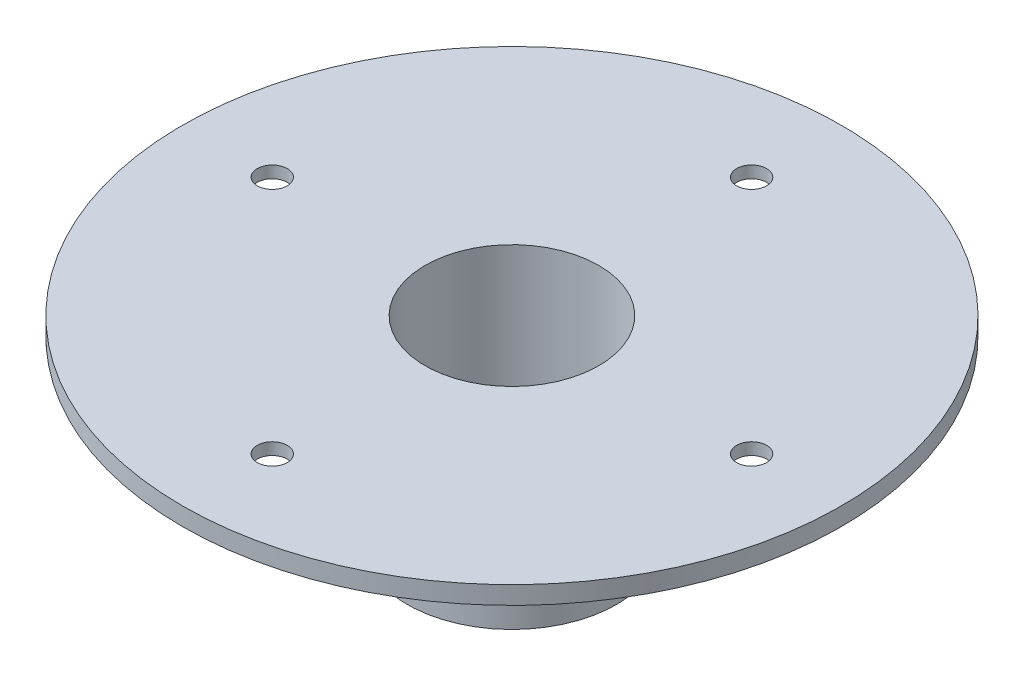
ISO-10303-21;
HEADER;
FILE_DESCRIPTION(('STEP AP214'),'2;1');
FILE_NAME('part.step','',(''),(''),'','','');
FILE_SCHEMA(('AUTOMOTIVE_DESIGN { 1 0 10303 214 1 1 1 1 }'));
ENDSEC;
DATA;
#1=APPLICATION_CONTEXT('core data for automotive mechanical design processes');
#2=APPLICATION_PROTOCOL_DEFINITION('international standard','automotive_design',2000,#1);
#3=PRODUCT_CONTEXT('',#1,'mechanical');
#4=PRODUCT('Part','Part','',(#3));
#5=PRODUCT_RELATED_PRODUCT_CATEGORY('part','',(#4));
#6=PRODUCT_DEFINITION_FORMATION('','',#4);
#7=PRODUCT_DEFINITION_CONTEXT('part definition',#1,'design');
#8=PRODUCT_DEFINITION('design','',#6,#7);
#9=PRODUCT_DEFINITION_SHAPE('','',#8);
#10=(LENGTH_UNIT() NAMED_UNIT(*) SI_UNIT(.MILLI.,.METRE.));
#11=(NAMED_UNIT(*) PLANE_ANGLE_UNIT() SI_UNIT($,.RADIAN.));
#12=(NAMED_UNIT(*) SI_UNIT($,.STERADIAN.) SOLID_ANGLE_UNIT());
#13=UNCERTAINTY_MEASURE_WITH_UNIT(LENGTH_MEASURE(1.E-05),#10,'distance_accuracy_value','');
#14=(GEOMETRIC_REPRESENTATION_CONTEXT(3) GLOBAL_UNCERTAINTY_ASSIGNED_CONTEXT((#13)) GLOBAL_UNIT_ASSIGNED_CONTEXT((#10,
#11,#12)) REPRESENTATION_CONTEXT('',''));
#15=CARTESIAN_POINT('',(0.,0.,0.));
#16=DIRECTION('',(0.,0.,1.));
#17=DIRECTION('',(1.,0.,0.));
#18=AXIS2_PLACEMENT_3D('',#15,#16,#17);
#19=CARTESIAN_POINT('',(-39.9999999999989,-30.,1.13441908361787E-12));
#20=DIRECTION('',(0.,1.,0.));
#21=DIRECTION('',(0.,0.,1.));
#22=AXIS2_PLACEMENT_3D('',#19,#20,#21);
#23=CYLINDRICAL_SURFACE('',#22,2.50000000000181);
#24=CARTESIAN_POINT('',(-39.9999999999989,3.,1.13441908361787E-12));
#25=DIRECTION('',(0.,1.,0.));
#26=DIRECTION('',(0.,0.,1.));
#27=AXIS2_PLACEMENT_3D('',#24,#25,#26);
#28=CIRCLE('',#27,2.50000000000181);
#29=CARTESIAN_POINT('',(-39.9999999999989,3.,2.50000000000295));
#30=VERTEX_POINT('',#29);
#31=EDGE_CURVE('E88',#30,#30,#28,.T.);
#32=ORIENTED_EDGE('',*,*,#31,.T.);
#33=EDGE_LOOP('',(#32));
#34=FACE_BOUND('',#33,.T.);
#35=CARTESIAN_POINT('',(-39.9999999999989,1.,1.13441908361787E-12));
#36=DIRECTION('',(0.,-1.,0.));
#37=DIRECTION('',(0.,0.,-1.));
#38=AXIS2_PLACEMENT_3D('',#35,#36,#37);
#39=CIRCLE('',#38,2.50000000000181);
#40=CARTESIAN_POINT('',(-39.9999999999989,1.,-2.50000000000068));
#41=VERTEX_POINT('',#40);
#42=EDGE_CURVE('E49',#41,#41,#39,.F.);
#43=ORIENTED_EDGE('',*,*,#42,.F.);
#44=EDGE_LOOP('',(#43));
#45=FACE_BOUND('',#44,.T.);
#46=ADVANCED_FACE('F45',(#34,#45),#23,.F.);
#47=CARTESIAN_POINT('',(2.25904099284255E-12,-30.,40.));
#48=DIRECTION('',(0.,1.,0.));
#49=DIRECTION('',(0.,0.,1.));
#50=AXIS2_PLACEMENT_3D('',#47,#48,#49);
#51=CYLINDRICAL_SURFACE('',#50,2.50000000000243);
#52=CARTESIAN_POINT('',(2.25904099284255E-12,3.,40.));
#53=DIRECTION('',(0.,1.,0.));
#54=DIRECTION('',(0.,0.,1.));
#55=AXIS2_PLACEMENT_3D('',#52,#53,#54);
#56=CIRCLE('',#55,2.50000000000243);
#57=CARTESIAN_POINT('',(2.25904099284255E-12,3.,42.5000000000024));
#58=VERTEX_POINT('',#57);
#59=EDGE_CURVE('E95',#58,#58,#56,.T.);
#60=ORIENTED_EDGE('',*,*,#59,.T.);
#61=EDGE_LOOP('',(#60));
#62=FACE_BOUND('',#61,.T.);
#63=CARTESIAN_POINT('',(2.25904099284255E-12,1.,40.));
#64=DIRECTION('',(0.,-1.,0.));
#65=DIRECTION('',(0.,0.,-1.));
#66=AXIS2_PLACEMENT_3D('',#63,#64,#65);
#67=CIRCLE('',#66,2.50000000000243);
#68=CARTESIAN_POINT('',(2.25904099284255E-12,1.,37.4999999999976));
#69=VERTEX_POINT('',#68);
#70=EDGE_CURVE('E80',#69,#69,#67,.F.);
#71=ORIENTED_EDGE('',*,*,#70,.F.);
#72=EDGE_LOOP('',(#71));
#73=FACE_BOUND('',#72,.T.);
#74=ADVANCED_FACE('F191',(#62,#73),#51,.F.);
#75=CARTESIAN_POINT('',(40.0000000000011,-30.,-1.12952049642128E-12));
#76=DIRECTION('',(0.,1.,0.));
#77=DIRECTION('',(0.,0.,1.));
#78=AXIS2_PLACEMENT_3D('',#75,#76,#77);
#79=CYLINDRICAL_SURFACE('',#78,2.50000000000088);
#80=CARTESIAN_POINT('',(40.0000000000011,3.,-1.12952049642128E-12));
#81=DIRECTION('',(0.,1.,0.));
#82=DIRECTION('',(0.,0.,1.));
#83=AXIS2_PLACEMENT_3D('',#80,#81,#82);
#84=CIRCLE('',#83,2.50000000000088);
#85=CARTESIAN_POINT('',(40.0000000000011,3.,2.49999999999975));
#86=VERTEX_POINT('',#85);
#87=EDGE_CURVE('E103',#86,#86,#84,.T.);
#88=ORIENTED_EDGE('',*,*,#87,.T.);
#89=EDGE_LOOP('',(#88));
#90=FACE_BOUND('',#89,.T.);
#91=CARTESIAN_POINT('',(40.0000000000011,1.,-1.12952049642128E-12));
#92=DIRECTION('',(0.,-1.,0.));
#93=DIRECTION('',(0.,0.,-1.));
#94=AXIS2_PLACEMENT_3D('',#91,#92,#93);
#95=CIRCLE('',#94,2.50000000000088);
#96=CARTESIAN_POINT('',(40.0000000000011,1.,-2.50000000000201));
#97=VERTEX_POINT('',#96);
#98=EDGE_CURVE('E76',#97,#97,#95,.F.);
#99=ORIENTED_EDGE('',*,*,#98,.F.);
#100=EDGE_LOOP('',(#99));
#101=FACE_BOUND('',#100,.T.);
#102=ADVANCED_FACE('F187',(#90,#101),#79,.F.);
#103=CARTESIAN_POINT('',(0.,-30.,-40.));
#104=DIRECTION('',(0.,1.,0.));
#105=DIRECTION('',(0.,0.,1.));
#106=AXIS2_PLACEMENT_3D('',#103,#104,#105);
#107=CYLINDRICAL_SURFACE('',#106,2.5);
#108=CARTESIAN_POINT('',(0.,3.,-40.));
#109=DIRECTION('',(0.,1.,0.));
#110=DIRECTION('',(0.,0.,1.));
#111=AXIS2_PLACEMENT_3D('',#108,#109,#110);
#112=CIRCLE('',#111,2.5);
#113=CARTESIAN_POINT('',(0.,3.,-37.5));
#114=VERTEX_POINT('',#113);
#115=EDGE_CURVE('E112',#114,#114,#112,.T.);
#116=ORIENTED_EDGE('',*,*,#115,.T.);
#117=EDGE_LOOP('',(#116));
#118=FACE_BOUND('',#117,.T.);
#119=CARTESIAN_POINT('',(0.,1.,-40.));
#120=DIRECTION('',(0.,-1.,0.));
#121=DIRECTION('',(0.,0.,-1.));
#122=AXIS2_PLACEMENT_3D('',#119,#120,#121);
#123=CIRCLE('',#122,2.5);
#124=CARTESIAN_POINT('',(0.,1.,-42.5));
#125=VERTEX_POINT('',#124);
#126=EDGE_CURVE('E72',#125,#125,#123,.F.);
#127=ORIENTED_EDGE('',*,*,#126,.F.);
#128=EDGE_LOOP('',(#127));
#129=FACE_BOUND('',#128,.T.);
#130=ADVANCED_FACE('F179',(#118,#129),#107,.F.);
#131=CARTESIAN_POINT('',(0.,3.,0.));
#132=DIRECTION('',(0.,-1.,0.));
#133=DIRECTION('',(0.,0.,-1.));
#134=AXIS2_PLACEMENT_3D('',#131,#132,#133);
#135=CYLINDRICAL_SURFACE('',#134,55.);
#136=CARTESIAN_POINT('',(0.,3.,0.));
#137=DIRECTION('',(0.,1.,0.));
#138=DIRECTION('',(0.,0.,1.));
#139=AXIS2_PLACEMENT_3D('',#136,#137,#138);
#140=CIRCLE('',#139,55.);
#141=CARTESIAN_POINT('',(0.,3.,55.));
#142=VERTEX_POINT('',#141);
#143=EDGE_CURVE('E54',#142,#142,#140,.T.);
#144=ORIENTED_EDGE('',*,*,#143,.F.);
#145=EDGE_LOOP('',(#144));
#146=FACE_BOUND('',#145,.T.);
#147=CARTESIAN_POINT('',(0.,0.,0.));
#148=DIRECTION('',(0.,1.,0.));
#149=DIRECTION('',(0.,0.,1.));
#150=AXIS2_PLACEMENT_3D('',#147,#148,#149);
#151=CIRCLE('',#150,55.);
#152=CARTESIAN_POINT('',(0.,0.,55.));
#153=VERTEX_POINT('',#152);
#154=EDGE_CURVE('E63',#153,#153,#151,.T.);
#155=ORIENTED_EDGE('',*,*,#154,.T.);
#156=EDGE_LOOP('',(#155));
#157=FACE_BOUND('',#156,.T.);
#158=ADVANCED_FACE('F47',(#146,#157),#135,.T.);
#159=CARTESIAN_POINT('',(0.,3.,0.));
#160=DIRECTION('',(0.,1.,0.));
#161=DIRECTION('',(0.,0.,1.));
#162=AXIS2_PLACEMENT_3D('',#159,#160,#161);
#163=PLANE('',#162);
#164=ORIENTED_EDGE('',*,*,#115,.F.);
#165=EDGE_LOOP('',(#164));
#166=FACE_BOUND('',#165,.T.);
#167=ORIENTED_EDGE('',*,*,#87,.F.);
#168=EDGE_LOOP('',(#167));
#169=FACE_BOUND('',#168,.T.);
#170=ORIENTED_EDGE('',*,*,#59,.F.);
#171=EDGE_LOOP('',(#170));
#172=FACE_BOUND('',#171,.T.);
#173=ORIENTED_EDGE('',*,*,#31,.F.);
#174=EDGE_LOOP('',(#173));
#175=FACE_BOUND('',#174,.T.);
#176=CARTESIAN_POINT('',(0.,3.,0.));
#177=DIRECTION('',(0.,-1.,0.));
#178=DIRECTION('',(0.,0.,-1.));
#179=AXIS2_PLACEMENT_3D('',#176,#177,#178);
#180=CIRCLE('',#179,14.5);
#181=CARTESIAN_POINT('',(0.,3.,-14.5));
#182=VERTEX_POINT('',#181);
#183=EDGE_CURVE('E107',#182,#182,#180,.T.);
#184=ORIENTED_EDGE('',*,*,#183,.T.);
#185=EDGE_LOOP('',(#184));
#186=FACE_BOUND('',#185,.T.);
#187=ORIENTED_EDGE('',*,*,#143,.T.);
#188=EDGE_LOOP('',(#187));
#189=FACE_BOUND('',#188,.T.);
#190=ADVANCED_FACE('F168',(#166,#169,#172,#175,#186,#189),#163,.T.);
#191=CARTESIAN_POINT('',(0.,0.,0.));
#192=DIRECTION('',(0.,1.,0.));
#193=DIRECTION('',(0.,0.,1.));
#194=AXIS2_PLACEMENT_3D('',#191,#192,#193);
#195=PLANE('',#194);
#196=CARTESIAN_POINT('',(2.25904099284255E-12,0.,40.));
#197=DIRECTION('',(0.,-1.,0.));
#198=DIRECTION('',(0.,0.,-1.));
#199=AXIS2_PLACEMENT_3D('',#196,#197,#198);
#200=CIRCLE('',#199,9.);
#201=CARTESIAN_POINT('',(2.25904099284255E-12,0.,31.));
#202=VERTEX_POINT('',#201);
#203=EDGE_CURVE('E146',#202,#202,#200,.T.);
#204=ORIENTED_EDGE('',*,*,#203,.F.);
#205=EDGE_LOOP('',(#204));
#206=FACE_BOUND('',#205,.T.);
#207=CARTESIAN_POINT('',(40.0000000000011,0.,-1.14421625801104E-12));
#208=DIRECTION('',(0.,-1.,0.));
#209=DIRECTION('',(0.,0.,-1.));
#210=AXIS2_PLACEMENT_3D('',#207,#208,#209);
#211=CIRCLE('',#210,9.00000000000087);
#212=CARTESIAN_POINT('',(40.0000000000011,0.,-9.00000000000202));
#213=VERTEX_POINT('',#212);
#214=EDGE_CURVE('E142',#213,#213,#211,.T.);
#215=ORIENTED_EDGE('',*,*,#214,.F.);
#216=EDGE_LOOP('',(#215));
#217=FACE_BOUND('',#216,.T.);
#218=CARTESIAN_POINT('',(0.,0.,-40.));
#219=DIRECTION('',(0.,-1.,0.));
#220=DIRECTION('',(0.,0.,-1.));
#221=AXIS2_PLACEMENT_3D('',#218,#219,#220);
#222=CIRCLE('',#221,9.0000000000024);
#223=CARTESIAN_POINT('',(0.,0.,-49.0000000000024));
#224=VERTEX_POINT('',#223);
#225=EDGE_CURVE('E134',#224,#224,#222,.T.);
#226=ORIENTED_EDGE('',*,*,#225,.F.);
#227=EDGE_LOOP('',(#226));
#228=FACE_BOUND('',#227,.T.);
#229=CARTESIAN_POINT('',(-39.9999999999989,0.,1.13931767081446E-12));
#230=DIRECTION('',(0.,-1.,0.));
#231=DIRECTION('',(0.,0.,-1.));
#232=AXIS2_PLACEMENT_3D('',#229,#230,#231);
#233=CIRCLE('',#232,9.0000000000018);
#234=CARTESIAN_POINT('',(-39.9999999999989,0.,-9.00000000000066));
#235=VERTEX_POINT('',#234);
#236=EDGE_CURVE('E127',#235,#235,#233,.T.);
#237=ORIENTED_EDGE('',*,*,#236,.F.);
#238=EDGE_LOOP('',(#237));
#239=FACE_BOUND('',#238,.T.);
#240=CARTESIAN_POINT('',(0.,0.,0.));
#241=DIRECTION('',(0.,-1.,0.));
#242=DIRECTION('',(0.,0.,-1.));
#243=AXIS2_PLACEMENT_3D('',#240,#241,#242);
#244=CIRCLE('',#243,17.5);
#245=CARTESIAN_POINT('',(0.,0.,-17.5));
#246=VERTEX_POINT('',#245);
#247=EDGE_CURVE('E10',#246,#246,#244,.T.);
#248=ORIENTED_EDGE('',*,*,#247,.F.);
#249=EDGE_LOOP('',(#248));
#250=FACE_BOUND('',#249,.T.);
#251=ORIENTED_EDGE('',*,*,#154,.F.);
#252=EDGE_LOOP('',(#251));
#253=FACE_BOUND('',#252,.T.);
#254=ADVANCED_FACE('F164',(#206,#217,#228,#239,#250,#253),#195,.F.);
#255=CARTESIAN_POINT('',(0.,-30.,0.));
#256=DIRECTION('',(0.,1.,0.));
#257=DIRECTION('',(0.,0.,1.));
#258=AXIS2_PLACEMENT_3D('',#255,#256,#257);
#259=CYLINDRICAL_SURFACE('',#258,17.5);
#260=CARTESIAN_POINT('',(0.,-30.,0.));
#261=DIRECTION('',(0.,-1.,0.));
#262=DIRECTION('',(0.,0.,-1.));
#263=AXIS2_PLACEMENT_3D('',#260,#261,#262);
#264=CIRCLE('',#263,17.5);
#265=CARTESIAN_POINT('',(0.,-30.,-17.5));
#266=VERTEX_POINT('',#265);
#267=EDGE_CURVE('E66',#266,#266,#264,.T.);
#268=ORIENTED_EDGE('',*,*,#267,.F.);
#269=EDGE_LOOP('',(#268));
#270=FACE_BOUND('',#269,.T.);
#271=ORIENTED_EDGE('',*,*,#247,.T.);
#272=EDGE_LOOP('',(#271));
#273=FACE_BOUND('',#272,.T.);
#274=ADVANCED_FACE('F167',(#270,#273),#259,.T.);
#275=CARTESIAN_POINT('',(0.,-30.,0.));
#276=DIRECTION('',(0.,-1.,0.));
#277=DIRECTION('',(0.,0.,-1.));
#278=AXIS2_PLACEMENT_3D('',#275,#276,#277);
#279=PLANE('',#278);
#280=CARTESIAN_POINT('',(0.,-30.,0.));
#281=DIRECTION('',(0.,-1.,0.));
#282=DIRECTION('',(0.,0.,-1.));
#283=AXIS2_PLACEMENT_3D('',#280,#281,#282);
#284=CIRCLE('',#283,14.5);
#285=CARTESIAN_POINT('',(0.,-30.,-14.5));
#286=VERTEX_POINT('',#285);
#287=EDGE_CURVE('E109',#286,#286,#284,.T.);
#288=ORIENTED_EDGE('',*,*,#287,.F.);
#289=EDGE_LOOP('',(#288));
#290=FACE_BOUND('',#289,.T.);
#291=ORIENTED_EDGE('',*,*,#267,.T.);
#292=EDGE_LOOP('',(#291));
#293=FACE_BOUND('',#292,.T.);
#294=ADVANCED_FACE('F205',(#290,#293),#279,.T.);
#295=CARTESIAN_POINT('',(0.,3.,0.));
#296=DIRECTION('',(0.,-1.,0.));
#297=DIRECTION('',(0.,0.,-1.));
#298=AXIS2_PLACEMENT_3D('',#295,#296,#297);
#299=CYLINDRICAL_SURFACE('',#298,14.5);
#300=ORIENTED_EDGE('',*,*,#183,.F.);
#301=EDGE_LOOP('',(#300));
#302=FACE_BOUND('',#301,.T.);
#303=ORIENTED_EDGE('',*,*,#287,.T.);
#304=EDGE_LOOP('',(#303));
#305=FACE_BOUND('',#304,.T.);
#306=ADVANCED_FACE('F201',(#302,#305),#299,.F.);
#307=CARTESIAN_POINT('',(0.,1.,-40.));
#308=DIRECTION('',(0.,-1.,0.));
#309=DIRECTION('',(0.,0.,-1.));
#310=AXIS2_PLACEMENT_3D('',#307,#308,#309);
#311=PLANE('',#310);
#312=CARTESIAN_POINT('',(0.,1.,-40.));
#313=DIRECTION('',(0.,-1.,0.));
#314=DIRECTION('',(0.,0.,-1.));
#315=AXIS2_PLACEMENT_3D('',#312,#313,#314);
#316=CIRCLE('',#315,9.0000000000024);
#317=CARTESIAN_POINT('',(0.,1.,-49.0000000000024));
#318=VERTEX_POINT('',#317);
#319=EDGE_CURVE('E131',#318,#318,#316,.T.);
#320=ORIENTED_EDGE('',*,*,#319,.T.);
#321=EDGE_LOOP('',(#320));
#322=FACE_BOUND('',#321,.T.);
#323=ORIENTED_EDGE('',*,*,#126,.T.);
#324=EDGE_LOOP('',(#323));
#325=FACE_BOUND('',#324,.T.);
#326=ADVANCED_FACE('F204',(#322,#325),#311,.T.);
#327=CARTESIAN_POINT('',(0.,1.,-40.));
#328=DIRECTION('',(0.,-1.,0.));
#329=DIRECTION('',(0.,0.,-1.));
#330=AXIS2_PLACEMENT_3D('',#327,#328,#329);
#331=CYLINDRICAL_SURFACE('',#330,9.0000000000024);
#332=ORIENTED_EDGE('',*,*,#319,.F.);
#333=EDGE_LOOP('',(#332));
#334=FACE_BOUND('',#333,.T.);
#335=ORIENTED_EDGE('',*,*,#225,.T.);
#336=EDGE_LOOP('',(#335));
#337=FACE_BOUND('',#336,.T.);
#338=ADVANCED_FACE('F246',(#334,#337),#331,.F.);
#339=CARTESIAN_POINT('',(40.0000000000011,1.,-1.14421625801104E-12));
#340=DIRECTION('',(0.,-1.,0.));
#341=DIRECTION('',(0.,0.,-1.));
#342=AXIS2_PLACEMENT_3D('',#339,#340,#341);
#343=PLANE('',#342);
#344=CARTESIAN_POINT('',(40.0000000000011,1.,-1.14421625801104E-12));
#345=DIRECTION('',(0.,-1.,0.));
#346=DIRECTION('',(0.,0.,-1.));
#347=AXIS2_PLACEMENT_3D('',#344,#345,#346);
#348=CIRCLE('',#347,9.00000000000087);
#349=CARTESIAN_POINT('',(40.0000000000011,1.,-9.00000000000202));
#350=VERTEX_POINT('',#349);
#351=EDGE_CURVE('E138',#350,#350,#348,.T.);
#352=ORIENTED_EDGE('',*,*,#351,.T.);
#353=EDGE_LOOP('',(#352));
#354=FACE_BOUND('',#353,.T.);
#355=ORIENTED_EDGE('',*,*,#98,.T.);
#356=EDGE_LOOP('',(#355));
#357=FACE_BOUND('',#356,.T.);
#358=ADVANCED_FACE('F253',(#354,#357),#343,.T.);
#359=CARTESIAN_POINT('',(40.0000000000011,1.,-1.14421625801104E-12));
#360=DIRECTION('',(0.,-1.,0.));
#361=DIRECTION('',(0.,0.,-1.));
#362=AXIS2_PLACEMENT_3D('',#359,#360,#361);
#363=CYLINDRICAL_SURFACE('',#362,9.00000000000087);
#364=ORIENTED_EDGE('',*,*,#351,.F.);
#365=EDGE_LOOP('',(#364));
#366=FACE_BOUND('',#365,.T.);
#367=ORIENTED_EDGE('',*,*,#214,.T.);
#368=EDGE_LOOP('',(#367));
#369=FACE_BOUND('',#368,.T.);
#370=ADVANCED_FACE('F260',(#366,#369),#363,.F.);
#371=CARTESIAN_POINT('',(2.25904099284255E-12,1.,40.));
#372=DIRECTION('',(0.,-1.,0.));
#373=DIRECTION('',(0.,0.,-1.));
#374=AXIS2_PLACEMENT_3D('',#371,#372,#373);
#375=PLANE('',#374);
#376=CARTESIAN_POINT('',(2.25904099284255E-12,1.,40.));
#377=DIRECTION('',(0.,-1.,0.));
#378=DIRECTION('',(0.,0.,-1.));
#379=AXIS2_PLACEMENT_3D('',#376,#377,#378);
#380=CIRCLE('',#379,9.);
#381=CARTESIAN_POINT('',(2.25904099284255E-12,1.,31.));
#382=VERTEX_POINT('',#381);
#383=EDGE_CURVE('E77',#382,#382,#380,.T.);
#384=ORIENTED_EDGE('',*,*,#383,.T.);
#385=EDGE_LOOP('',(#384));
#386=FACE_BOUND('',#385,.T.);
#387=ORIENTED_EDGE('',*,*,#70,.T.);
#388=EDGE_LOOP('',(#387));
#389=FACE_BOUND('',#388,.T.);
#390=ADVANCED_FACE('F155',(#386,#389),#375,.T.);
#391=CARTESIAN_POINT('',(2.25904099284255E-12,1.,40.));
#392=DIRECTION('',(0.,-1.,0.));
#393=DIRECTION('',(0.,0.,-1.));
#394=AXIS2_PLACEMENT_3D('',#391,#392,#393);
#395=CYLINDRICAL_SURFACE('',#394,9.);
#396=ORIENTED_EDGE('',*,*,#383,.F.);
#397=EDGE_LOOP('',(#396));
#398=FACE_BOUND('',#397,.T.);
#399=ORIENTED_EDGE('',*,*,#203,.T.);
#400=EDGE_LOOP('',(#399));
#401=FACE_BOUND('',#400,.T.);
#402=ADVANCED_FACE('F157',(#398,#401),#395,.F.);
#403=CARTESIAN_POINT('',(-39.9999999999989,1.,1.13931767081446E-12));
#404=DIRECTION('',(0.,-1.,0.));
#405=DIRECTION('',(0.,0.,-1.));
#406=AXIS2_PLACEMENT_3D('',#403,#404,#405);
#407=PLANE('',#406);
#408=CARTESIAN_POINT('',(-39.9999999999989,1.,1.13931767081446E-12));
#409=DIRECTION('',(0.,-1.,0.));
#410=DIRECTION('',(0.,0.,-1.));
#411=AXIS2_PLACEMENT_3D('',#408,#409,#410);
#412=CIRCLE('',#411,9.0000000000018);
#413=CARTESIAN_POINT('',(-39.9999999999989,1.,-9.00000000000066));
#414=VERTEX_POINT('',#413);
#415=EDGE_CURVE('E124',#414,#414,#412,.T.);
#416=ORIENTED_EDGE('',*,*,#415,.T.);
#417=EDGE_LOOP('',(#416));
#418=FACE_BOUND('',#417,.T.);
#419=ORIENTED_EDGE('',*,*,#42,.T.);
#420=EDGE_LOOP('',(#419));
#421=FACE_BOUND('',#420,.T.);
#422=ADVANCED_FACE('F160',(#418,#421),#407,.T.);
#423=CARTESIAN_POINT('',(-39.9999999999989,1.,1.13931767081446E-12));
#424=DIRECTION('',(0.,-1.,0.));
#425=DIRECTION('',(0.,0.,-1.));
#426=AXIS2_PLACEMENT_3D('',#423,#424,#425);
#427=CYLINDRICAL_SURFACE('',#426,9.0000000000018);
#428=ORIENTED_EDGE('',*,*,#415,.F.);
#429=EDGE_LOOP('',(#428));
#430=FACE_BOUND('',#429,.T.);
#431=ORIENTED_EDGE('',*,*,#236,.T.);
#432=EDGE_LOOP('',(#431));
#433=FACE_BOUND('',#432,.T.);
#434=ADVANCED_FACE('F281',(#430,#433),#427,.F.);
#435=CLOSED_SHELL('',(#46,#74,#102,#130,#158,#190,#254,#274,#294,#306,#326,#338,#358,#370,#390,
#402,#422,#434));
#436=MANIFOLD_SOLID_BREP('B2',#435);
#437=ADVANCED_BREP_SHAPE_REPRESENTATION('',(#18,#436),#14);
#438=SHAPE_DEFINITION_REPRESENTATION(#9,#437);
ENDSEC;
END-ISO-10303-21;
